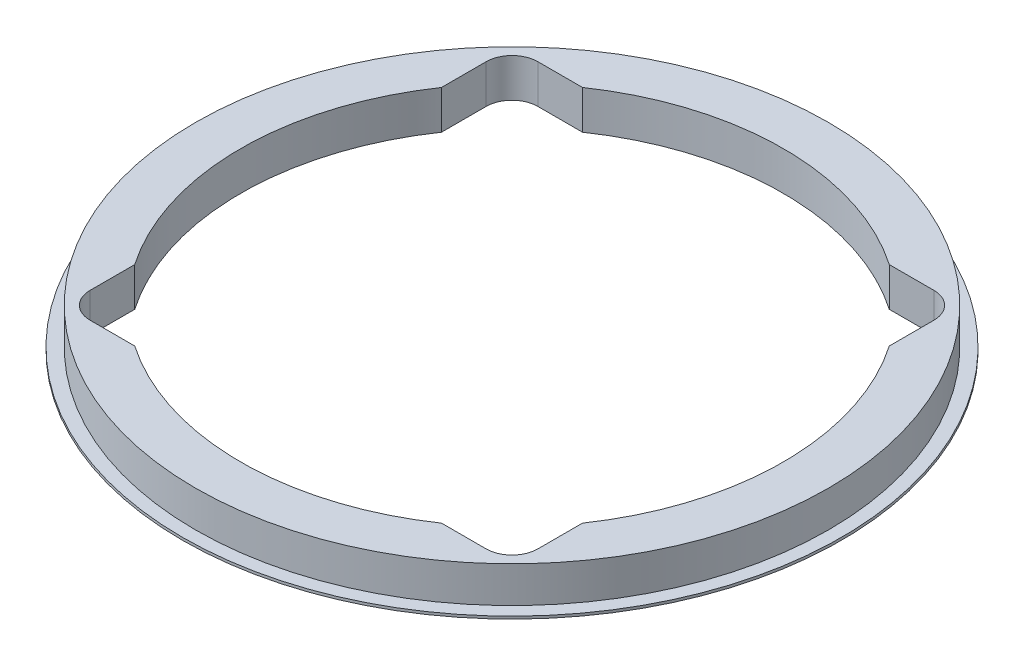
ISO-10303-21;
HEADER;
FILE_DESCRIPTION(('STEP AP214'),'2;1');
FILE_NAME('part.step','',(''),(''),'','','');
FILE_SCHEMA(('AUTOMOTIVE_DESIGN { 1 0 10303 214 1 1 1 1 }'));
ENDSEC;
DATA;
#1=APPLICATION_CONTEXT('core data for automotive mechanical design processes');
#2=APPLICATION_PROTOCOL_DEFINITION('international standard','automotive_design',2000,#1);
#3=PRODUCT_CONTEXT('',#1,'mechanical');
#4=PRODUCT('Part','Part','',(#3));
#5=PRODUCT_RELATED_PRODUCT_CATEGORY('part','',(#4));
#6=PRODUCT_DEFINITION_FORMATION('','',#4);
#7=PRODUCT_DEFINITION_CONTEXT('part definition',#1,'design');
#8=PRODUCT_DEFINITION('design','',#6,#7);
#9=PRODUCT_DEFINITION_SHAPE('','',#8);
#10=(LENGTH_UNIT() NAMED_UNIT(*) SI_UNIT(.MILLI.,.METRE.));
#11=(NAMED_UNIT(*) PLANE_ANGLE_UNIT() SI_UNIT($,.RADIAN.));
#12=(NAMED_UNIT(*) SI_UNIT($,.STERADIAN.) SOLID_ANGLE_UNIT());
#13=UNCERTAINTY_MEASURE_WITH_UNIT(LENGTH_MEASURE(1.E-05),#10,'distance_accuracy_value','');
#14=(GEOMETRIC_REPRESENTATION_CONTEXT(3) GLOBAL_UNCERTAINTY_ASSIGNED_CONTEXT((#13)) GLOBAL_UNIT_ASSIGNED_CONTEXT((#10,
#11,#12)) REPRESENTATION_CONTEXT('',''));
#15=CARTESIAN_POINT('',(0.,0.,0.));
#16=DIRECTION('',(0.,0.,1.));
#17=DIRECTION('',(1.,0.,0.));
#18=AXIS2_PLACEMENT_3D('',#15,#16,#17);
#19=CARTESIAN_POINT('',(0.,3.,0.));
#20=DIRECTION('',(0.,1.,0.));
#21=DIRECTION('',(0.,0.,1.));
#22=AXIS2_PLACEMENT_3D('',#19,#20,#21);
#23=PLANE('',#22);
#24=CARTESIAN_POINT('',(0.,3.,0.));
#25=DIRECTION('',(0.,1.,0.));
#26=DIRECTION('',(0.,0.,1.));
#27=AXIS2_PLACEMENT_3D('',#24,#25,#26);
#28=CIRCLE('',#27,24.5);
#29=CARTESIAN_POINT('',(0.,3.,24.5));
#30=VERTEX_POINT('',#29);
#31=EDGE_CURVE('E49',#30,#30,#28,.T.);
#32=ORIENTED_EDGE('',*,*,#31,.T.);
#33=EDGE_LOOP('',(#32));
#34=FACE_BOUND('',#33,.T.);
#35=CARTESIAN_POINT('',(-15.3241161390704,3.,-15.3241161390704));
#36=DIRECTION('',(0.,1.,0.));
#37=DIRECTION('',(0.,0.,1.));
#38=AXIS2_PLACEMENT_3D('',#35,#36,#37);
#39=CIRCLE('',#38,2.);
#40=CARTESIAN_POINT('',(-15.3241161390704,3.,-17.3241161390704));
#41=VERTEX_POINT('',#40);
#42=CARTESIAN_POINT('',(-17.3241161390704,3.,-15.3241161390704));
#43=VERTEX_POINT('',#42);
#44=EDGE_CURVE('E43',#41,#43,#39,.T.);
#45=ORIENTED_EDGE('',*,*,#44,.F.);
#46=DIRECTION('',(1.,0.,0.));
#47=VECTOR('',#46,1.);
#48=CARTESIAN_POINT('',(0.,3.,-17.3241161390704));
#49=LINE('',#48,#47);
#50=CARTESIAN_POINT('',(-11.8690774704692,3.,-17.3241161390704));
#51=VERTEX_POINT('',#50);
#52=EDGE_CURVE('E95',#41,#51,#49,.T.);
#53=ORIENTED_EDGE('',*,*,#52,.T.);
#54=CARTESIAN_POINT('',(0.,3.,0.));
#55=DIRECTION('',(0.,1.,0.));
#56=DIRECTION('',(0.,0.,1.));
#57=AXIS2_PLACEMENT_3D('',#54,#55,#56);
#58=CIRCLE('',#57,21.);
#59=CARTESIAN_POINT('',(11.8690774704692,3.,-17.3241161390704));
#60=VERTEX_POINT('',#59);
#61=EDGE_CURVE('E141',#60,#51,#58,.T.);
#62=ORIENTED_EDGE('',*,*,#61,.F.);
#63=CARTESIAN_POINT('',(15.3241161390704,3.,-17.3241161390704));
#64=VERTEX_POINT('',#63);
#65=EDGE_CURVE('E182',#60,#64,#49,.T.);
#66=ORIENTED_EDGE('',*,*,#65,.T.);
#67=CARTESIAN_POINT('',(15.3241161390704,3.,-15.3241161390704));
#68=DIRECTION('',(0.,1.,0.));
#69=DIRECTION('',(0.,0.,1.));
#70=AXIS2_PLACEMENT_3D('',#67,#68,#69);
#71=CIRCLE('',#70,2.);
#72=CARTESIAN_POINT('',(17.3241161390704,3.,-15.3241161390704));
#73=VERTEX_POINT('',#72);
#74=EDGE_CURVE('E164',#73,#64,#71,.T.);
#75=ORIENTED_EDGE('',*,*,#74,.F.);
#76=DIRECTION('',(0.,0.,1.));
#77=VECTOR('',#76,1.);
#78=CARTESIAN_POINT('',(17.3241161390704,3.,0.));
#79=LINE('',#78,#77);
#80=CARTESIAN_POINT('',(17.3241161390704,3.,-11.8690774704692));
#81=VERTEX_POINT('',#80);
#82=EDGE_CURVE('E162',#73,#81,#79,.T.);
#83=ORIENTED_EDGE('',*,*,#82,.T.);
#84=CARTESIAN_POINT('',(17.3241161390704,3.,11.8690774704692));
#85=VERTEX_POINT('',#84);
#86=EDGE_CURVE('E145',#85,#81,#58,.T.);
#87=ORIENTED_EDGE('',*,*,#86,.F.);
#88=CARTESIAN_POINT('',(17.3241161390704,3.,15.3241161390704));
#89=VERTEX_POINT('',#88);
#90=EDGE_CURVE('E179',#85,#89,#79,.T.);
#91=ORIENTED_EDGE('',*,*,#90,.T.);
#92=CARTESIAN_POINT('',(15.3241161390704,3.,15.3241161390704));
#93=DIRECTION('',(0.,1.,0.));
#94=DIRECTION('',(0.,0.,1.));
#95=AXIS2_PLACEMENT_3D('',#92,#93,#94);
#96=CIRCLE('',#95,2.);
#97=CARTESIAN_POINT('',(15.3241161390704,3.,17.3241161390704));
#98=VERTEX_POINT('',#97);
#99=EDGE_CURVE('E161',#98,#89,#96,.T.);
#100=ORIENTED_EDGE('',*,*,#99,.F.);
#101=DIRECTION('',(-1.,0.,0.));
#102=VECTOR('',#101,1.);
#103=CARTESIAN_POINT('',(0.,3.,17.3241161390704));
#104=LINE('',#103,#102);
#105=CARTESIAN_POINT('',(11.8690774704692,3.,17.3241161390704));
#106=VERTEX_POINT('',#105);
#107=EDGE_CURVE('E126',#98,#106,#104,.T.);
#108=ORIENTED_EDGE('',*,*,#107,.T.);
#109=CARTESIAN_POINT('',(-11.8690774704692,3.,17.3241161390704));
#110=VERTEX_POINT('',#109);
#111=EDGE_CURVE('E142',#110,#106,#58,.T.);
#112=ORIENTED_EDGE('',*,*,#111,.F.);
#113=CARTESIAN_POINT('',(-15.3241161390704,3.,17.3241161390704));
#114=VERTEX_POINT('',#113);
#115=EDGE_CURVE('E184',#110,#114,#104,.T.);
#116=ORIENTED_EDGE('',*,*,#115,.T.);
#117=CARTESIAN_POINT('',(-15.3241161390704,3.,15.3241161390704));
#118=DIRECTION('',(0.,1.,0.));
#119=DIRECTION('',(0.,0.,1.));
#120=AXIS2_PLACEMENT_3D('',#117,#118,#119);
#121=CIRCLE('',#120,2.);
#122=CARTESIAN_POINT('',(-17.3241161390704,3.,15.3241161390704));
#123=VERTEX_POINT('',#122);
#124=EDGE_CURVE('E158',#123,#114,#121,.T.);
#125=ORIENTED_EDGE('',*,*,#124,.F.);
#126=DIRECTION('',(0.,0.,-1.));
#127=VECTOR('',#126,1.);
#128=CARTESIAN_POINT('',(-17.3241161390704,3.,0.));
#129=LINE('',#128,#127);
#130=CARTESIAN_POINT('',(-17.3241161390704,3.,11.8690774704692));
#131=VERTEX_POINT('',#130);
#132=EDGE_CURVE('E125',#123,#131,#129,.T.);
#133=ORIENTED_EDGE('',*,*,#132,.T.);
#134=CARTESIAN_POINT('',(-17.3241161390704,3.,-11.8690774704692));
#135=VERTEX_POINT('',#134);
#136=EDGE_CURVE('E133',#135,#131,#58,.T.);
#137=ORIENTED_EDGE('',*,*,#136,.F.);
#138=EDGE_CURVE('E116',#135,#43,#129,.T.);
#139=ORIENTED_EDGE('',*,*,#138,.T.);
#140=EDGE_LOOP('',(#45,#53,#62,#66,#75,#83,#87,#91,#100,#108,#112,#116,#125,#133,#137,#139));
#141=FACE_BOUND('',#140,.T.);
#142=ADVANCED_FACE('F39',(#34,#141),#23,.T.);
#143=CARTESIAN_POINT('',(0.,0.,0.));
#144=DIRECTION('',(0.,1.,0.));
#145=DIRECTION('',(0.,0.,1.));
#146=AXIS2_PLACEMENT_3D('',#143,#144,#145);
#147=PLANE('',#146);
#148=CARTESIAN_POINT('',(0.,0.,0.));
#149=DIRECTION('',(0.,-1.,0.));
#150=DIRECTION('',(0.,0.,-1.));
#151=AXIS2_PLACEMENT_3D('',#148,#149,#150);
#152=CIRCLE('',#151,25.5);
#153=CARTESIAN_POINT('',(0.,0.,-25.5));
#154=VERTEX_POINT('',#153);
#155=EDGE_CURVE('E150',#154,#154,#152,.T.);
#156=ORIENTED_EDGE('',*,*,#155,.T.);
#157=EDGE_LOOP('',(#156));
#158=FACE_BOUND('',#157,.T.);
#159=DIRECTION('',(1.,0.,0.));
#160=VECTOR('',#159,1.);
#161=CARTESIAN_POINT('',(-15.3241161390704,0.,-17.3241161390704));
#162=LINE('',#161,#160);
#163=CARTESIAN_POINT('',(-15.3241161390704,0.,-17.3241161390704));
#164=VERTEX_POINT('',#163);
#165=CARTESIAN_POINT('',(-11.8690774704692,0.,-17.3241161390704));
#166=VERTEX_POINT('',#165);
#167=EDGE_CURVE('E136',#164,#166,#162,.T.);
#168=ORIENTED_EDGE('',*,*,#167,.F.);
#169=CARTESIAN_POINT('',(-15.3241161390704,0.,-15.3241161390704));
#170=DIRECTION('',(0.,1.,0.));
#171=DIRECTION('',(0.,0.,1.));
#172=AXIS2_PLACEMENT_3D('',#169,#170,#171);
#173=CIRCLE('',#172,2.);
#174=CARTESIAN_POINT('',(-17.3241161390704,0.,-15.3241161390704));
#175=VERTEX_POINT('',#174);
#176=EDGE_CURVE('E191',#175,#164,#173,.F.);
#177=ORIENTED_EDGE('',*,*,#176,.F.);
#178=DIRECTION('',(0.,0.,-1.));
#179=VECTOR('',#178,1.);
#180=CARTESIAN_POINT('',(-17.3241161390704,0.,-15.3241161390704));
#181=LINE('',#180,#179);
#182=CARTESIAN_POINT('',(-17.3241161390704,0.,-11.8690774704692));
#183=VERTEX_POINT('',#182);
#184=EDGE_CURVE('E104',#183,#175,#181,.T.);
#185=ORIENTED_EDGE('',*,*,#184,.F.);
#186=CARTESIAN_POINT('',(0.,0.,0.));
#187=DIRECTION('',(0.,1.,0.));
#188=DIRECTION('',(0.,0.,1.));
#189=AXIS2_PLACEMENT_3D('',#186,#187,#188);
#190=CIRCLE('',#189,21.);
#191=CARTESIAN_POINT('',(-17.3241161390704,0.,11.8690774704692));
#192=VERTEX_POINT('',#191);
#193=EDGE_CURVE('E135',#183,#192,#190,.T.);
#194=ORIENTED_EDGE('',*,*,#193,.T.);
#195=DIRECTION('',(0.,0.,-1.));
#196=VECTOR('',#195,1.);
#197=CARTESIAN_POINT('',(-17.3241161390704,0.,-15.3241161390704));
#198=LINE('',#197,#196);
#199=CARTESIAN_POINT('',(-17.3241161390704,0.,15.3241161390704));
#200=VERTEX_POINT('',#199);
#201=EDGE_CURVE('E229',#200,#192,#198,.T.);
#202=ORIENTED_EDGE('',*,*,#201,.F.);
#203=CARTESIAN_POINT('',(-15.3241161390704,0.,15.3241161390704));
#204=DIRECTION('',(0.,1.,0.));
#205=DIRECTION('',(0.,0.,1.));
#206=AXIS2_PLACEMENT_3D('',#203,#204,#205);
#207=CIRCLE('',#206,2.);
#208=CARTESIAN_POINT('',(-15.3241161390704,0.,17.3241161390704));
#209=VERTEX_POINT('',#208);
#210=EDGE_CURVE('E244',#209,#200,#207,.F.);
#211=ORIENTED_EDGE('',*,*,#210,.F.);
#212=DIRECTION('',(-1.,0.,0.));
#213=VECTOR('',#212,1.);
#214=CARTESIAN_POINT('',(-15.3241161390704,0.,17.3241161390704));
#215=LINE('',#214,#213);
#216=CARTESIAN_POINT('',(-11.8690774704692,0.,17.3241161390704));
#217=VERTEX_POINT('',#216);
#218=EDGE_CURVE('E241',#217,#209,#215,.T.);
#219=ORIENTED_EDGE('',*,*,#218,.F.);
#220=CARTESIAN_POINT('',(11.8690774704692,0.,17.3241161390704));
#221=VERTEX_POINT('',#220);
#222=EDGE_CURVE('E152',#217,#221,#190,.T.);
#223=ORIENTED_EDGE('',*,*,#222,.T.);
#224=DIRECTION('',(-1.,0.,0.));
#225=VECTOR('',#224,1.);
#226=CARTESIAN_POINT('',(-15.3241161390704,0.,17.3241161390704));
#227=LINE('',#226,#225);
#228=CARTESIAN_POINT('',(15.3241161390704,0.,17.3241161390704));
#229=VERTEX_POINT('',#228);
#230=EDGE_CURVE('E58',#229,#221,#227,.T.);
#231=ORIENTED_EDGE('',*,*,#230,.F.);
#232=CARTESIAN_POINT('',(15.3241161390704,0.,15.3241161390704));
#233=DIRECTION('',(0.,1.,0.));
#234=DIRECTION('',(0.,0.,1.));
#235=AXIS2_PLACEMENT_3D('',#232,#233,#234);
#236=CIRCLE('',#235,2.);
#237=CARTESIAN_POINT('',(17.3241161390704,0.,15.3241161390704));
#238=VERTEX_POINT('',#237);
#239=EDGE_CURVE('E219',#238,#229,#236,.F.);
#240=ORIENTED_EDGE('',*,*,#239,.F.);
#241=DIRECTION('',(0.,0.,1.));
#242=VECTOR('',#241,1.);
#243=CARTESIAN_POINT('',(17.3241161390704,0.,-15.3241161390704));
#244=LINE('',#243,#242);
#245=CARTESIAN_POINT('',(17.3241161390704,0.,11.8690774704692));
#246=VERTEX_POINT('',#245);
#247=EDGE_CURVE('E204',#246,#238,#244,.T.);
#248=ORIENTED_EDGE('',*,*,#247,.F.);
#249=CARTESIAN_POINT('',(17.3241161390704,0.,-11.8690774704692));
#250=VERTEX_POINT('',#249);
#251=EDGE_CURVE('E147',#246,#250,#190,.T.);
#252=ORIENTED_EDGE('',*,*,#251,.T.);
#253=DIRECTION('',(0.,0.,1.));
#254=VECTOR('',#253,1.);
#255=CARTESIAN_POINT('',(17.3241161390704,0.,-15.3241161390704));
#256=LINE('',#255,#254);
#257=CARTESIAN_POINT('',(17.3241161390704,0.,-15.3241161390704));
#258=VERTEX_POINT('',#257);
#259=EDGE_CURVE('E197',#258,#250,#256,.T.);
#260=ORIENTED_EDGE('',*,*,#259,.F.);
#261=CARTESIAN_POINT('',(15.3241161390704,0.,-15.3241161390704));
#262=DIRECTION('',(0.,1.,0.));
#263=DIRECTION('',(0.,0.,1.));
#264=AXIS2_PLACEMENT_3D('',#261,#262,#263);
#265=CIRCLE('',#264,2.);
#266=CARTESIAN_POINT('',(15.3241161390704,0.,-17.3241161390704));
#267=VERTEX_POINT('',#266);
#268=EDGE_CURVE('E208',#267,#258,#265,.F.);
#269=ORIENTED_EDGE('',*,*,#268,.F.);
#270=DIRECTION('',(1.,0.,0.));
#271=VECTOR('',#270,1.);
#272=CARTESIAN_POINT('',(-15.3241161390704,0.,-17.3241161390704));
#273=LINE('',#272,#271);
#274=CARTESIAN_POINT('',(11.8690774704692,0.,-17.3241161390704));
#275=VERTEX_POINT('',#274);
#276=EDGE_CURVE('E205',#275,#267,#273,.T.);
#277=ORIENTED_EDGE('',*,*,#276,.F.);
#278=EDGE_CURVE('E270',#275,#166,#190,.T.);
#279=ORIENTED_EDGE('',*,*,#278,.T.);
#280=EDGE_LOOP('',(#168,#177,#185,#194,#202,#211,#219,#223,#231,#240,#248,#252,#260,#269,#277,#279));
#281=FACE_BOUND('',#280,.T.);
#282=ADVANCED_FACE('F266',(#158,#281),#147,.F.);
#283=CARTESIAN_POINT('',(0.,3.,0.));
#284=DIRECTION('',(0.,-1.,0.));
#285=DIRECTION('',(0.,0.,-1.));
#286=AXIS2_PLACEMENT_3D('',#283,#284,#285);
#287=CYLINDRICAL_SURFACE('',#286,21.);
#288=ORIENTED_EDGE('',*,*,#86,.T.);
#289=DIRECTION('',(0.,-1.,0.));
#290=VECTOR('',#289,1.);
#291=CARTESIAN_POINT('',(17.3241161390704,3.,-11.8690774704692));
#292=LINE('',#291,#290);
#293=EDGE_CURVE('E201',#81,#250,#292,.T.);
#294=ORIENTED_EDGE('',*,*,#293,.T.);
#295=ORIENTED_EDGE('',*,*,#251,.F.);
#296=DIRECTION('',(0.,-1.,0.));
#297=VECTOR('',#296,1.);
#298=CARTESIAN_POINT('',(17.3241161390704,3.,11.8690774704692));
#299=LINE('',#298,#297);
#300=EDGE_CURVE('E224',#246,#85,#299,.F.);
#301=ORIENTED_EDGE('',*,*,#300,.T.);
#302=EDGE_LOOP('',(#288,#294,#295,#301));
#303=FACE_BOUND('',#302,.T.);
#304=ADVANCED_FACE('F287',(#303),#287,.F.);
#305=ORIENTED_EDGE('',*,*,#61,.T.);
#306=DIRECTION('',(0.,-1.,0.));
#307=VECTOR('',#306,1.);
#308=CARTESIAN_POINT('',(-11.8690774704692,3.,-17.3241161390704));
#309=LINE('',#308,#307);
#310=EDGE_CURVE('E137',#51,#166,#309,.T.);
#311=ORIENTED_EDGE('',*,*,#310,.T.);
#312=ORIENTED_EDGE('',*,*,#278,.F.);
#313=DIRECTION('',(0.,-1.,0.));
#314=VECTOR('',#313,1.);
#315=CARTESIAN_POINT('',(11.8690774704692,3.,-17.3241161390704));
#316=LINE('',#315,#314);
#317=EDGE_CURVE('E200',#275,#60,#316,.F.);
#318=ORIENTED_EDGE('',*,*,#317,.T.);
#319=EDGE_LOOP('',(#305,#311,#312,#318));
#320=FACE_BOUND('',#319,.T.);
#321=ADVANCED_FACE('F309',(#320),#287,.F.);
#322=ORIENTED_EDGE('',*,*,#136,.T.);
#323=DIRECTION('',(0.,-1.,0.));
#324=VECTOR('',#323,1.);
#325=CARTESIAN_POINT('',(-17.3241161390704,3.,11.8690774704692));
#326=LINE('',#325,#324);
#327=EDGE_CURVE('E240',#131,#192,#326,.T.);
#328=ORIENTED_EDGE('',*,*,#327,.T.);
#329=ORIENTED_EDGE('',*,*,#193,.F.);
#330=DIRECTION('',(0.,-1.,0.));
#331=VECTOR('',#330,1.);
#332=CARTESIAN_POINT('',(-17.3241161390704,3.,-11.8690774704692));
#333=LINE('',#332,#331);
#334=EDGE_CURVE('E119',#183,#135,#333,.F.);
#335=ORIENTED_EDGE('',*,*,#334,.T.);
#336=EDGE_LOOP('',(#322,#328,#329,#335));
#337=FACE_BOUND('',#336,.T.);
#338=ADVANCED_FACE('F131',(#337),#287,.F.);
#339=ORIENTED_EDGE('',*,*,#111,.T.);
#340=DIRECTION('',(0.,-1.,0.));
#341=VECTOR('',#340,1.);
#342=CARTESIAN_POINT('',(11.8690774704692,3.,17.3241161390704));
#343=LINE('',#342,#341);
#344=EDGE_CURVE('E220',#106,#221,#343,.T.);
#345=ORIENTED_EDGE('',*,*,#344,.T.);
#346=ORIENTED_EDGE('',*,*,#222,.F.);
#347=DIRECTION('',(0.,-1.,0.));
#348=VECTOR('',#347,1.);
#349=CARTESIAN_POINT('',(-11.8690774704692,3.,17.3241161390704));
#350=LINE('',#349,#348);
#351=EDGE_CURVE('E237',#217,#110,#350,.F.);
#352=ORIENTED_EDGE('',*,*,#351,.T.);
#353=EDGE_LOOP('',(#339,#345,#346,#352));
#354=FACE_BOUND('',#353,.T.);
#355=ADVANCED_FACE('F327',(#354),#287,.F.);
#356=CARTESIAN_POINT('',(0.,3.,0.));
#357=DIRECTION('',(0.,-1.,0.));
#358=DIRECTION('',(0.,0.,-1.));
#359=AXIS2_PLACEMENT_3D('',#356,#357,#358);
#360=CYLINDRICAL_SURFACE('',#359,24.5);
#361=ORIENTED_EDGE('',*,*,#31,.F.);
#362=EDGE_LOOP('',(#361));
#363=FACE_BOUND('',#362,.T.);
#364=CARTESIAN_POINT('',(0.,0.2,0.));
#365=DIRECTION('',(0.,-1.,0.));
#366=DIRECTION('',(0.,0.,-1.));
#367=AXIS2_PLACEMENT_3D('',#364,#365,#366);
#368=CIRCLE('',#367,24.5);
#369=CARTESIAN_POINT('',(0.,0.2,-24.5));
#370=VERTEX_POINT('',#369);
#371=EDGE_CURVE('E11',#370,#370,#368,.T.);
#372=ORIENTED_EDGE('',*,*,#371,.F.);
#373=EDGE_LOOP('',(#372));
#374=FACE_BOUND('',#373,.T.);
#375=ADVANCED_FACE('F41',(#363,#374),#360,.T.);
#376=CARTESIAN_POINT('',(0.,0.2,0.));
#377=DIRECTION('',(0.,-1.,0.));
#378=DIRECTION('',(0.,0.,-1.));
#379=AXIS2_PLACEMENT_3D('',#376,#377,#378);
#380=CYLINDRICAL_SURFACE('',#379,25.5);
#381=CARTESIAN_POINT('',(0.,0.2,0.));
#382=DIRECTION('',(0.,-1.,0.));
#383=DIRECTION('',(0.,0.,-1.));
#384=AXIS2_PLACEMENT_3D('',#381,#382,#383);
#385=CIRCLE('',#384,25.5);
#386=CARTESIAN_POINT('',(0.,0.2,-25.5));
#387=VERTEX_POINT('',#386);
#388=EDGE_CURVE('E155',#387,#387,#385,.T.);
#389=ORIENTED_EDGE('',*,*,#388,.T.);
#390=EDGE_LOOP('',(#389));
#391=FACE_BOUND('',#390,.T.);
#392=ORIENTED_EDGE('',*,*,#155,.F.);
#393=EDGE_LOOP('',(#392));
#394=FACE_BOUND('',#393,.T.);
#395=ADVANCED_FACE('F344',(#391,#394),#380,.T.);
#396=CARTESIAN_POINT('',(0.,0.2,0.));
#397=DIRECTION('',(0.,-1.,0.));
#398=DIRECTION('',(0.,0.,-1.));
#399=AXIS2_PLACEMENT_3D('',#396,#397,#398);
#400=PLANE('',#399);
#401=ORIENTED_EDGE('',*,*,#371,.T.);
#402=EDGE_LOOP('',(#401));
#403=FACE_BOUND('',#402,.T.);
#404=ORIENTED_EDGE('',*,*,#388,.F.);
#405=EDGE_LOOP('',(#404));
#406=FACE_BOUND('',#405,.T.);
#407=ADVANCED_FACE('F337',(#403,#406),#400,.F.);
#408=CARTESIAN_POINT('',(-15.3241161390704,3.000012,17.3241161390704));
#409=DIRECTION('',(0.,0.,-1.));
#410=DIRECTION('',(-1.,0.,0.));
#411=AXIS2_PLACEMENT_3D('',#408,#409,#410);
#412=PLANE('',#411);
#413=ORIENTED_EDGE('',*,*,#351,.F.);
#414=ORIENTED_EDGE('',*,*,#218,.T.);
#415=DIRECTION('',(0.,1.,0.));
#416=VECTOR('',#415,1.);
#417=CARTESIAN_POINT('',(-15.3241161390704,-0.00100000000000013,17.3241161390704));
#418=LINE('',#417,#416);
#419=EDGE_CURVE('E234',#209,#114,#418,.T.);
#420=ORIENTED_EDGE('',*,*,#419,.T.);
#421=ORIENTED_EDGE('',*,*,#115,.F.);
#422=EDGE_LOOP('',(#413,#414,#420,#421));
#423=FACE_BOUND('',#422,.T.);
#424=ADVANCED_FACE('F335',(#423),#412,.T.);
#425=CARTESIAN_POINT('',(-17.3241161390704,3.000012,-15.3241161390704));
#426=DIRECTION('',(1.,0.,0.));
#427=DIRECTION('',(0.,0.,-1.));
#428=AXIS2_PLACEMENT_3D('',#425,#426,#427);
#429=PLANE('',#428);
#430=DIRECTION('',(0.,1.,0.));
#431=VECTOR('',#430,1.);
#432=CARTESIAN_POINT('',(-17.3241161390704,-0.00100000000000013,15.3241161390704));
#433=LINE('',#432,#431);
#434=EDGE_CURVE('E236',#200,#123,#433,.T.);
#435=ORIENTED_EDGE('',*,*,#434,.F.);
#436=ORIENTED_EDGE('',*,*,#201,.T.);
#437=ORIENTED_EDGE('',*,*,#327,.F.);
#438=ORIENTED_EDGE('',*,*,#132,.F.);
#439=EDGE_LOOP('',(#435,#436,#437,#438));
#440=FACE_BOUND('',#439,.T.);
#441=ADVANCED_FACE('F263',(#440),#429,.T.);
#442=CARTESIAN_POINT('',(-15.3241161390704,-0.00100000000000013,15.3241161390704));
#443=DIRECTION('',(0.,1.,0.));
#444=DIRECTION('',(0.,0.,1.));
#445=AXIS2_PLACEMENT_3D('',#442,#443,#444);
#446=CYLINDRICAL_SURFACE('',#445,2.);
#447=ORIENTED_EDGE('',*,*,#124,.T.);
#448=ORIENTED_EDGE('',*,*,#419,.F.);
#449=ORIENTED_EDGE('',*,*,#210,.T.);
#450=ORIENTED_EDGE('',*,*,#434,.T.);
#451=EDGE_LOOP('',(#447,#448,#449,#450));
#452=FACE_BOUND('',#451,.T.);
#453=ADVANCED_FACE('F256',(#452),#446,.F.);
#454=CARTESIAN_POINT('',(17.3241161390704,3.000012,-15.3241161390704));
#455=DIRECTION('',(-1.,0.,0.));
#456=DIRECTION('',(0.,0.,1.));
#457=AXIS2_PLACEMENT_3D('',#454,#455,#456);
#458=PLANE('',#457);
#459=ORIENTED_EDGE('',*,*,#300,.F.);
#460=ORIENTED_EDGE('',*,*,#247,.T.);
#461=DIRECTION('',(0.,1.,0.));
#462=VECTOR('',#461,1.);
#463=CARTESIAN_POINT('',(17.3241161390704,-0.00100000000000013,15.3241161390704));
#464=LINE('',#463,#462);
#465=EDGE_CURVE('E217',#238,#89,#464,.T.);
#466=ORIENTED_EDGE('',*,*,#465,.T.);
#467=ORIENTED_EDGE('',*,*,#90,.F.);
#468=EDGE_LOOP('',(#459,#460,#466,#467));
#469=FACE_BOUND('',#468,.T.);
#470=ADVANCED_FACE('F320',(#469),#458,.T.);
#471=DIRECTION('',(0.,1.,0.));
#472=VECTOR('',#471,1.);
#473=CARTESIAN_POINT('',(15.3241161390704,-0.00100000000000013,17.3241161390704));
#474=LINE('',#473,#472);
#475=EDGE_CURVE('E221',#229,#98,#474,.T.);
#476=ORIENTED_EDGE('',*,*,#475,.F.);
#477=ORIENTED_EDGE('',*,*,#230,.T.);
#478=ORIENTED_EDGE('',*,*,#344,.F.);
#479=ORIENTED_EDGE('',*,*,#107,.F.);
#480=EDGE_LOOP('',(#476,#477,#478,#479));
#481=FACE_BOUND('',#480,.T.);
#482=ADVANCED_FACE('F324',(#481),#412,.T.);
#483=CARTESIAN_POINT('',(15.3241161390704,-0.00100000000000013,15.3241161390704));
#484=DIRECTION('',(0.,1.,0.));
#485=DIRECTION('',(0.,0.,1.));
#486=AXIS2_PLACEMENT_3D('',#483,#484,#485);
#487=CYLINDRICAL_SURFACE('',#486,2.);
#488=ORIENTED_EDGE('',*,*,#99,.T.);
#489=ORIENTED_EDGE('',*,*,#465,.F.);
#490=ORIENTED_EDGE('',*,*,#239,.T.);
#491=ORIENTED_EDGE('',*,*,#475,.T.);
#492=EDGE_LOOP('',(#488,#489,#490,#491));
#493=FACE_BOUND('',#492,.T.);
#494=ADVANCED_FACE('F323',(#493),#487,.F.);
#495=ORIENTED_EDGE('',*,*,#334,.F.);
#496=ORIENTED_EDGE('',*,*,#184,.T.);
#497=DIRECTION('',(0.,1.,0.));
#498=VECTOR('',#497,1.);
#499=CARTESIAN_POINT('',(-17.3241161390704,-0.00100000000000013,-15.3241161390704));
#500=LINE('',#499,#498);
#501=EDGE_CURVE('E120',#175,#43,#500,.T.);
#502=ORIENTED_EDGE('',*,*,#501,.T.);
#503=ORIENTED_EDGE('',*,*,#138,.F.);
#504=EDGE_LOOP('',(#495,#496,#502,#503));
#505=FACE_BOUND('',#504,.T.);
#506=ADVANCED_FACE('F118',(#505),#429,.T.);
#507=CARTESIAN_POINT('',(-15.3241161390704,3.000012,-17.3241161390704));
#508=DIRECTION('',(0.,0.,1.));
#509=DIRECTION('',(1.,0.,0.));
#510=AXIS2_PLACEMENT_3D('',#507,#508,#509);
#511=PLANE('',#510);
#512=DIRECTION('',(0.,1.,0.));
#513=VECTOR('',#512,1.);
#514=CARTESIAN_POINT('',(-15.3241161390704,-0.00100000000000013,-17.3241161390704));
#515=LINE('',#514,#513);
#516=EDGE_CURVE('E188',#164,#41,#515,.T.);
#517=ORIENTED_EDGE('',*,*,#516,.F.);
#518=ORIENTED_EDGE('',*,*,#167,.T.);
#519=ORIENTED_EDGE('',*,*,#310,.F.);
#520=ORIENTED_EDGE('',*,*,#52,.F.);
#521=EDGE_LOOP('',(#517,#518,#519,#520));
#522=FACE_BOUND('',#521,.T.);
#523=ADVANCED_FACE('F307',(#522),#511,.T.);
#524=CARTESIAN_POINT('',(-15.3241161390704,-0.00100000000000013,-15.3241161390704));
#525=DIRECTION('',(0.,1.,0.));
#526=DIRECTION('',(0.,0.,1.));
#527=AXIS2_PLACEMENT_3D('',#524,#525,#526);
#528=CYLINDRICAL_SURFACE('',#527,2.);
#529=ORIENTED_EDGE('',*,*,#44,.T.);
#530=ORIENTED_EDGE('',*,*,#501,.F.);
#531=ORIENTED_EDGE('',*,*,#176,.T.);
#532=ORIENTED_EDGE('',*,*,#516,.T.);
#533=EDGE_LOOP('',(#529,#530,#531,#532));
#534=FACE_BOUND('',#533,.T.);
#535=ADVANCED_FACE('F368',(#534),#528,.F.);
#536=DIRECTION('',(0.,1.,0.));
#537=VECTOR('',#536,1.);
#538=CARTESIAN_POINT('',(17.3241161390704,-0.00100000000000013,-15.3241161390704));
#539=LINE('',#538,#537);
#540=EDGE_CURVE('E202',#258,#73,#539,.T.);
#541=ORIENTED_EDGE('',*,*,#540,.F.);
#542=ORIENTED_EDGE('',*,*,#259,.T.);
#543=ORIENTED_EDGE('',*,*,#293,.F.);
#544=ORIENTED_EDGE('',*,*,#82,.F.);
#545=EDGE_LOOP('',(#541,#542,#543,#544));
#546=FACE_BOUND('',#545,.T.);
#547=ADVANCED_FACE('F317',(#546),#458,.T.);
#548=ORIENTED_EDGE('',*,*,#317,.F.);
#549=ORIENTED_EDGE('',*,*,#276,.T.);
#550=DIRECTION('',(0.,1.,0.));
#551=VECTOR('',#550,1.);
#552=CARTESIAN_POINT('',(15.3241161390704,-0.00100000000000013,-17.3241161390704));
#553=LINE('',#552,#551);
#554=EDGE_CURVE('E198',#267,#64,#553,.T.);
#555=ORIENTED_EDGE('',*,*,#554,.T.);
#556=ORIENTED_EDGE('',*,*,#65,.F.);
#557=EDGE_LOOP('',(#548,#549,#555,#556));
#558=FACE_BOUND('',#557,.T.);
#559=ADVANCED_FACE('F313',(#558),#511,.T.);
#560=CARTESIAN_POINT('',(15.3241161390704,-0.00100000000000013,-15.3241161390704));
#561=DIRECTION('',(0.,1.,0.));
#562=DIRECTION('',(0.,0.,1.));
#563=AXIS2_PLACEMENT_3D('',#560,#561,#562);
#564=CYLINDRICAL_SURFACE('',#563,2.);
#565=ORIENTED_EDGE('',*,*,#74,.T.);
#566=ORIENTED_EDGE('',*,*,#554,.F.);
#567=ORIENTED_EDGE('',*,*,#268,.T.);
#568=ORIENTED_EDGE('',*,*,#540,.T.);
#569=EDGE_LOOP('',(#565,#566,#567,#568));
#570=FACE_BOUND('',#569,.T.);
#571=ADVANCED_FACE('F314',(#570),#564,.F.);
#572=CLOSED_SHELL('',(#142,#282,#304,#321,#338,#355,#375,#395,#407,#424,#441,#453,#470,#482,
#494,#506,#523,#535,#547,#559,#571));
#573=MANIFOLD_SOLID_BREP('B2',#572);
#574=ADVANCED_BREP_SHAPE_REPRESENTATION('',(#18,#573),#14);
#575=SHAPE_DEFINITION_REPRESENTATION(#9,#574);
ENDSEC;
END-ISO-10303-21;
